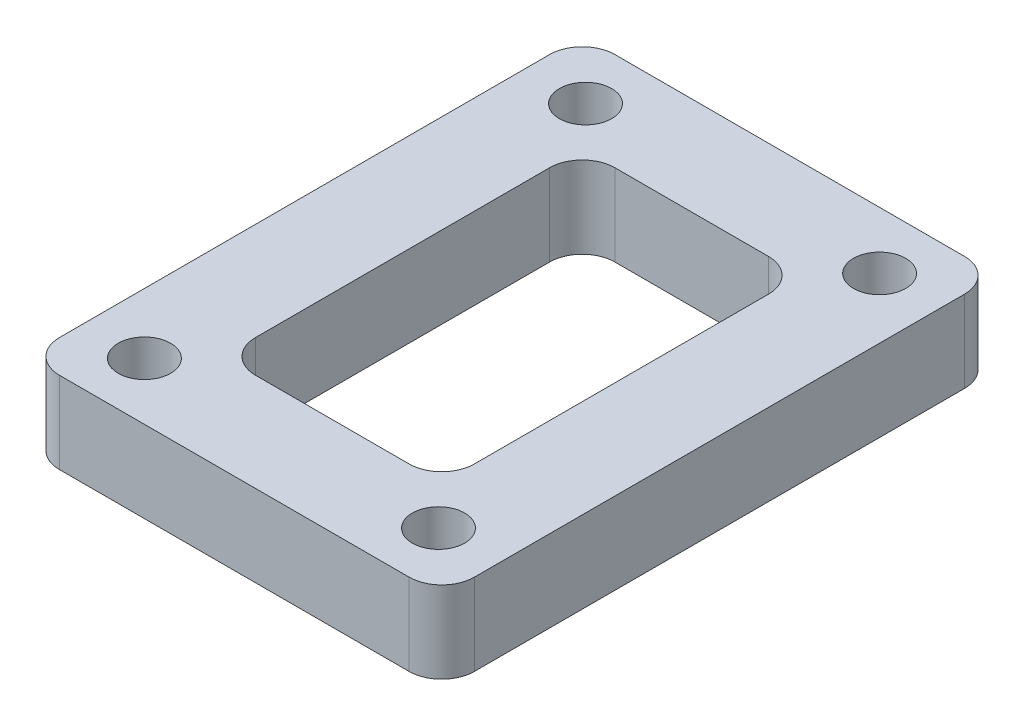
ISO-10303-21;
HEADER;
FILE_DESCRIPTION(('STEP AP214'),'2;1');
FILE_NAME('part.step','',(''),(''),'','','');
FILE_SCHEMA(('AUTOMOTIVE_DESIGN { 1 0 10303 214 1 1 1 1 }'));
ENDSEC;
DATA;
#1=APPLICATION_CONTEXT('core data for automotive mechanical design processes');
#2=APPLICATION_PROTOCOL_DEFINITION('international standard','automotive_design',2000,#1);
#3=PRODUCT_CONTEXT('',#1,'mechanical');
#4=PRODUCT('Part','Part','',(#3));
#5=PRODUCT_RELATED_PRODUCT_CATEGORY('part','',(#4));
#6=PRODUCT_DEFINITION_FORMATION('','',#4);
#7=PRODUCT_DEFINITION_CONTEXT('part definition',#1,'design');
#8=PRODUCT_DEFINITION('design','',#6,#7);
#9=PRODUCT_DEFINITION_SHAPE('','',#8);
#10=(LENGTH_UNIT() NAMED_UNIT(*) SI_UNIT(.MILLI.,.METRE.));
#11=(NAMED_UNIT(*) PLANE_ANGLE_UNIT() SI_UNIT($,.RADIAN.));
#12=(NAMED_UNIT(*) SI_UNIT($,.STERADIAN.) SOLID_ANGLE_UNIT());
#13=UNCERTAINTY_MEASURE_WITH_UNIT(LENGTH_MEASURE(1.E-05),#10,'distance_accuracy_value','');
#14=(GEOMETRIC_REPRESENTATION_CONTEXT(3) GLOBAL_UNCERTAINTY_ASSIGNED_CONTEXT((#13)) GLOBAL_UNIT_ASSIGNED_CONTEXT((#10,
#11,#12)) REPRESENTATION_CONTEXT('',''));
#15=CARTESIAN_POINT('',(0.,0.,0.));
#16=DIRECTION('',(0.,0.,1.));
#17=DIRECTION('',(1.,0.,0.));
#18=AXIS2_PLACEMENT_3D('',#15,#16,#17);
#19=CARTESIAN_POINT('',(0.,5.,0.));
#20=DIRECTION('',(0.,1.,0.));
#21=DIRECTION('',(0.,0.,1.));
#22=AXIS2_PLACEMENT_3D('',#19,#20,#21);
#23=PLANE('',#22);
#24=CARTESIAN_POINT('',(9.,5.,13.5));
#25=DIRECTION('',(0.,1.,0.));
#26=DIRECTION('',(0.,0.,1.));
#27=AXIS2_PLACEMENT_3D('',#24,#25,#26);
#28=CIRCLE('',#27,1.6);
#29=CARTESIAN_POINT('',(9.,5.,15.1));
#30=VERTEX_POINT('',#29);
#31=EDGE_CURVE('E532',#30,#30,#28,.T.);
#32=ORIENTED_EDGE('',*,*,#31,.F.);
#33=EDGE_LOOP('',(#32));
#34=FACE_BOUND('',#33,.T.);
#35=CARTESIAN_POINT('',(-9.,5.,-13.5));
#36=DIRECTION('',(0.,1.,0.));
#37=DIRECTION('',(0.,0.,1.));
#38=AXIS2_PLACEMENT_3D('',#35,#36,#37);
#39=CIRCLE('',#38,1.6);
#40=CARTESIAN_POINT('',(-9.,5.,-11.9));
#41=VERTEX_POINT('',#40);
#42=EDGE_CURVE('E279',#41,#41,#39,.T.);
#43=ORIENTED_EDGE('',*,*,#42,.F.);
#44=EDGE_LOOP('',(#43));
#45=FACE_BOUND('',#44,.T.);
#46=DIRECTION('',(-1.,0.,0.));
#47=VECTOR('',#46,1.);
#48=CARTESIAN_POINT('',(-12.7,5.,-17.));
#49=LINE('',#48,#47);
#50=CARTESIAN_POINT('',(10.7,5.,-17.));
#51=VERTEX_POINT('',#50);
#52=CARTESIAN_POINT('',(-10.7,5.,-17.));
#53=VERTEX_POINT('',#52);
#54=EDGE_CURVE('E284',#51,#53,#49,.T.);
#55=ORIENTED_EDGE('',*,*,#54,.T.);
#56=CARTESIAN_POINT('',(-10.7,5.,-15.));
#57=DIRECTION('',(0.,1.,0.));
#58=DIRECTION('',(0.,0.,1.));
#59=AXIS2_PLACEMENT_3D('',#56,#57,#58);
#60=CIRCLE('',#59,2.);
#61=CARTESIAN_POINT('',(-12.7,5.,-15.));
#62=VERTEX_POINT('',#61);
#63=EDGE_CURVE('E201',#53,#62,#60,.T.);
#64=ORIENTED_EDGE('',*,*,#63,.T.);
#65=DIRECTION('',(0.,0.,1.));
#66=VECTOR('',#65,1.);
#67=CARTESIAN_POINT('',(-12.7,5.,-17.));
#68=LINE('',#67,#66);
#69=CARTESIAN_POINT('',(-12.7,5.,15.));
#70=VERTEX_POINT('',#69);
#71=EDGE_CURVE('E169',#62,#70,#68,.T.);
#72=ORIENTED_EDGE('',*,*,#71,.T.);
#73=CARTESIAN_POINT('',(-10.7,5.,15.));
#74=DIRECTION('',(0.,1.,0.));
#75=DIRECTION('',(0.,0.,1.));
#76=AXIS2_PLACEMENT_3D('',#73,#74,#75);
#77=CIRCLE('',#76,2.);
#78=CARTESIAN_POINT('',(-10.7,5.,17.));
#79=VERTEX_POINT('',#78);
#80=EDGE_CURVE('E195',#70,#79,#77,.T.);
#81=ORIENTED_EDGE('',*,*,#80,.T.);
#82=DIRECTION('',(1.,0.,0.));
#83=VECTOR('',#82,1.);
#84=CARTESIAN_POINT('',(-12.7,5.,17.));
#85=LINE('',#84,#83);
#86=CARTESIAN_POINT('',(10.7,5.,17.));
#87=VERTEX_POINT('',#86);
#88=EDGE_CURVE('E186',#79,#87,#85,.T.);
#89=ORIENTED_EDGE('',*,*,#88,.T.);
#90=CARTESIAN_POINT('',(10.7,5.,15.));
#91=DIRECTION('',(0.,1.,0.));
#92=DIRECTION('',(0.,0.,1.));
#93=AXIS2_PLACEMENT_3D('',#90,#91,#92);
#94=CIRCLE('',#93,2.);
#95=CARTESIAN_POINT('',(12.7,5.,15.));
#96=VERTEX_POINT('',#95);
#97=EDGE_CURVE('E197',#87,#96,#94,.T.);
#98=ORIENTED_EDGE('',*,*,#97,.T.);
#99=DIRECTION('',(0.,0.,-1.));
#100=VECTOR('',#99,1.);
#101=CARTESIAN_POINT('',(12.7,5.,-17.));
#102=LINE('',#101,#100);
#103=CARTESIAN_POINT('',(12.7,5.,-15.));
#104=VERTEX_POINT('',#103);
#105=EDGE_CURVE('E180',#96,#104,#102,.T.);
#106=ORIENTED_EDGE('',*,*,#105,.T.);
#107=CARTESIAN_POINT('',(10.7,5.,-15.));
#108=DIRECTION('',(0.,1.,0.));
#109=DIRECTION('',(0.,0.,1.));
#110=AXIS2_PLACEMENT_3D('',#107,#108,#109);
#111=CIRCLE('',#110,2.);
#112=EDGE_CURVE('E199',#104,#51,#111,.T.);
#113=ORIENTED_EDGE('',*,*,#112,.T.);
#114=EDGE_LOOP('',(#55,#64,#72,#81,#89,#98,#106,#113));
#115=FACE_BOUND('',#114,.T.);
#116=DIRECTION('',(0.,0.,1.));
#117=VECTOR('',#116,1.);
#118=CARTESIAN_POINT('',(-6.7,5.,-11.));
#119=LINE('',#118,#117);
#120=CARTESIAN_POINT('',(-6.7,5.,-9.00000000000001));
#121=VERTEX_POINT('',#120);
#122=CARTESIAN_POINT('',(-6.7,5.,9.));
#123=VERTEX_POINT('',#122);
#124=EDGE_CURVE('E260',#121,#123,#119,.T.);
#125=ORIENTED_EDGE('',*,*,#124,.F.);
#126=CARTESIAN_POINT('',(-4.7,5.,-9.00000000000001));
#127=DIRECTION('',(0.,1.,0.));
#128=DIRECTION('',(0.,0.,1.));
#129=AXIS2_PLACEMENT_3D('',#126,#127,#128);
#130=CIRCLE('',#129,2.);
#131=CARTESIAN_POINT('',(-4.7,5.,-11.));
#132=VERTEX_POINT('',#131);
#133=EDGE_CURVE('E241',#121,#132,#130,.F.);
#134=ORIENTED_EDGE('',*,*,#133,.T.);
#135=DIRECTION('',(-1.,0.,0.));
#136=VECTOR('',#135,1.);
#137=CARTESIAN_POINT('',(-6.7,5.,-11.));
#138=LINE('',#137,#136);
#139=CARTESIAN_POINT('',(4.7,5.,-11.));
#140=VERTEX_POINT('',#139);
#141=EDGE_CURVE('E266',#140,#132,#138,.T.);
#142=ORIENTED_EDGE('',*,*,#141,.F.);
#143=CARTESIAN_POINT('',(4.7,5.,-9.00000000000001));
#144=DIRECTION('',(0.,1.,0.));
#145=DIRECTION('',(0.,0.,1.));
#146=AXIS2_PLACEMENT_3D('',#143,#144,#145);
#147=CIRCLE('',#146,2.);
#148=CARTESIAN_POINT('',(6.7,5.,-9.00000000000001));
#149=VERTEX_POINT('',#148);
#150=EDGE_CURVE('E237',#140,#149,#147,.F.);
#151=ORIENTED_EDGE('',*,*,#150,.T.);
#152=DIRECTION('',(0.,0.,-1.));
#153=VECTOR('',#152,1.);
#154=CARTESIAN_POINT('',(6.7,5.,-11.));
#155=LINE('',#154,#153);
#156=CARTESIAN_POINT('',(6.7,5.,9.));
#157=VERTEX_POINT('',#156);
#158=EDGE_CURVE('E268',#157,#149,#155,.T.);
#159=ORIENTED_EDGE('',*,*,#158,.F.);
#160=CARTESIAN_POINT('',(4.7,5.,9.));
#161=DIRECTION('',(0.,1.,0.));
#162=DIRECTION('',(0.,0.,1.));
#163=AXIS2_PLACEMENT_3D('',#160,#161,#162);
#164=CIRCLE('',#163,2.);
#165=CARTESIAN_POINT('',(4.7,5.,11.));
#166=VERTEX_POINT('',#165);
#167=EDGE_CURVE('E50',#157,#166,#164,.F.);
#168=ORIENTED_EDGE('',*,*,#167,.T.);
#169=DIRECTION('',(1.,0.,0.));
#170=VECTOR('',#169,1.);
#171=CARTESIAN_POINT('',(-6.7,5.,11.));
#172=LINE('',#171,#170);
#173=CARTESIAN_POINT('',(-4.7,5.,11.));
#174=VERTEX_POINT('',#173);
#175=EDGE_CURVE('E262',#174,#166,#172,.T.);
#176=ORIENTED_EDGE('',*,*,#175,.F.);
#177=CARTESIAN_POINT('',(-4.7,5.,9.));
#178=DIRECTION('',(0.,1.,0.));
#179=DIRECTION('',(0.,0.,1.));
#180=AXIS2_PLACEMENT_3D('',#177,#178,#179);
#181=CIRCLE('',#180,2.);
#182=EDGE_CURVE('E11',#174,#123,#181,.F.);
#183=ORIENTED_EDGE('',*,*,#182,.T.);
#184=EDGE_LOOP('',(#125,#134,#142,#151,#159,#168,#176,#183));
#185=FACE_BOUND('',#184,.T.);
#186=CARTESIAN_POINT('',(9.,5.,-13.5));
#187=DIRECTION('',(0.,1.,0.));
#188=DIRECTION('',(0.,0.,-1.));
#189=AXIS2_PLACEMENT_3D('',#186,#187,#188);
#190=CIRCLE('',#189,1.6);
#191=CARTESIAN_POINT('',(9.,5.,-15.1));
#192=VERTEX_POINT('',#191);
#193=EDGE_CURVE('E525',#192,#192,#190,.T.);
#194=ORIENTED_EDGE('',*,*,#193,.F.);
#195=EDGE_LOOP('',(#194));
#196=FACE_BOUND('',#195,.T.);
#197=CARTESIAN_POINT('',(-9.,5.,13.5));
#198=DIRECTION('',(0.,1.,0.));
#199=DIRECTION('',(0.,0.,-1.));
#200=AXIS2_PLACEMENT_3D('',#197,#198,#199);
#201=CIRCLE('',#200,1.6);
#202=CARTESIAN_POINT('',(-9.,5.,11.9));
#203=VERTEX_POINT('',#202);
#204=EDGE_CURVE('E537',#203,#203,#201,.T.);
#205=ORIENTED_EDGE('',*,*,#204,.F.);
#206=EDGE_LOOP('',(#205));
#207=FACE_BOUND('',#206,.T.);
#208=ADVANCED_FACE('F35',(#34,#45,#115,#185,#196,#207),#23,.T.);
#209=CARTESIAN_POINT('',(0.,0.,0.));
#210=DIRECTION('',(0.,1.,0.));
#211=DIRECTION('',(0.,0.,1.));
#212=AXIS2_PLACEMENT_3D('',#209,#210,#211);
#213=PLANE('',#212);
#214=DIRECTION('',(0.,0.,1.));
#215=VECTOR('',#214,1.);
#216=CARTESIAN_POINT('',(-12.7,0.,-17.));
#217=LINE('',#216,#215);
#218=CARTESIAN_POINT('',(-12.7,0.,-15.));
#219=VERTEX_POINT('',#218);
#220=CARTESIAN_POINT('',(-12.7,0.,15.));
#221=VERTEX_POINT('',#220);
#222=EDGE_CURVE('E166',#219,#221,#217,.T.);
#223=ORIENTED_EDGE('',*,*,#222,.F.);
#224=CARTESIAN_POINT('',(-10.7,0.,-15.));
#225=DIRECTION('',(0.,1.,0.));
#226=DIRECTION('',(0.,0.,1.));
#227=AXIS2_PLACEMENT_3D('',#224,#225,#226);
#228=CIRCLE('',#227,2.);
#229=CARTESIAN_POINT('',(-10.7,0.,-17.));
#230=VERTEX_POINT('',#229);
#231=EDGE_CURVE('E149',#219,#230,#228,.F.);
#232=ORIENTED_EDGE('',*,*,#231,.T.);
#233=DIRECTION('',(-1.,0.,0.));
#234=VECTOR('',#233,1.);
#235=CARTESIAN_POINT('',(-12.7,0.,-17.));
#236=LINE('',#235,#234);
#237=CARTESIAN_POINT('',(10.7,0.,-17.));
#238=VERTEX_POINT('',#237);
#239=EDGE_CURVE('E177',#238,#230,#236,.T.);
#240=ORIENTED_EDGE('',*,*,#239,.F.);
#241=CARTESIAN_POINT('',(10.7,0.,-15.));
#242=DIRECTION('',(0.,1.,0.));
#243=DIRECTION('',(0.,0.,1.));
#244=AXIS2_PLACEMENT_3D('',#241,#242,#243);
#245=CIRCLE('',#244,2.);
#246=CARTESIAN_POINT('',(12.7,0.,-15.));
#247=VERTEX_POINT('',#246);
#248=EDGE_CURVE('E160',#238,#247,#245,.F.);
#249=ORIENTED_EDGE('',*,*,#248,.T.);
#250=DIRECTION('',(0.,0.,-1.));
#251=VECTOR('',#250,1.);
#252=CARTESIAN_POINT('',(12.7,0.,-17.));
#253=LINE('',#252,#251);
#254=CARTESIAN_POINT('',(12.7,0.,15.));
#255=VERTEX_POINT('',#254);
#256=EDGE_CURVE('E182',#255,#247,#253,.T.);
#257=ORIENTED_EDGE('',*,*,#256,.F.);
#258=CARTESIAN_POINT('',(10.7,0.,15.));
#259=DIRECTION('',(0.,1.,0.));
#260=DIRECTION('',(0.,0.,1.));
#261=AXIS2_PLACEMENT_3D('',#258,#259,#260);
#262=CIRCLE('',#261,2.);
#263=CARTESIAN_POINT('',(10.7,0.,17.));
#264=VERTEX_POINT('',#263);
#265=EDGE_CURVE('E189',#255,#264,#262,.F.);
#266=ORIENTED_EDGE('',*,*,#265,.T.);
#267=DIRECTION('',(1.,0.,0.));
#268=VECTOR('',#267,1.);
#269=CARTESIAN_POINT('',(-12.7,0.,17.));
#270=LINE('',#269,#268);
#271=CARTESIAN_POINT('',(-10.7,0.,17.));
#272=VERTEX_POINT('',#271);
#273=EDGE_CURVE('E176',#272,#264,#270,.T.);
#274=ORIENTED_EDGE('',*,*,#273,.F.);
#275=CARTESIAN_POINT('',(-10.7,0.,15.));
#276=DIRECTION('',(0.,1.,0.));
#277=DIRECTION('',(0.,0.,1.));
#278=AXIS2_PLACEMENT_3D('',#275,#276,#277);
#279=CIRCLE('',#278,2.);
#280=EDGE_CURVE('E170',#272,#221,#279,.F.);
#281=ORIENTED_EDGE('',*,*,#280,.T.);
#282=EDGE_LOOP('',(#223,#232,#240,#249,#257,#266,#274,#281));
#283=FACE_BOUND('',#282,.T.);
#284=DIRECTION('',(0.,0.,-1.));
#285=VECTOR('',#284,1.);
#286=CARTESIAN_POINT('',(6.7,0.,-11.));
#287=LINE('',#286,#285);
#288=CARTESIAN_POINT('',(6.7,0.,9.));
#289=VERTEX_POINT('',#288);
#290=CARTESIAN_POINT('',(6.7,0.,-9.00000000000001));
#291=VERTEX_POINT('',#290);
#292=EDGE_CURVE('E253',#289,#291,#287,.T.);
#293=ORIENTED_EDGE('',*,*,#292,.T.);
#294=CARTESIAN_POINT('',(4.7,0.,-9.00000000000001));
#295=DIRECTION('',(0.,1.,0.));
#296=DIRECTION('',(0.,0.,1.));
#297=AXIS2_PLACEMENT_3D('',#294,#295,#296);
#298=CIRCLE('',#297,2.);
#299=CARTESIAN_POINT('',(4.7,0.,-11.));
#300=VERTEX_POINT('',#299);
#301=EDGE_CURVE('E235',#291,#300,#298,.T.);
#302=ORIENTED_EDGE('',*,*,#301,.T.);
#303=DIRECTION('',(-1.,0.,0.));
#304=VECTOR('',#303,1.);
#305=CARTESIAN_POINT('',(-6.7,0.,-11.));
#306=LINE('',#305,#304);
#307=CARTESIAN_POINT('',(-4.7,0.,-11.));
#308=VERTEX_POINT('',#307);
#309=EDGE_CURVE('E276',#300,#308,#306,.T.);
#310=ORIENTED_EDGE('',*,*,#309,.T.);
#311=CARTESIAN_POINT('',(-4.7,0.,-9.00000000000001));
#312=DIRECTION('',(0.,1.,0.));
#313=DIRECTION('',(0.,0.,1.));
#314=AXIS2_PLACEMENT_3D('',#311,#312,#313);
#315=CIRCLE('',#314,2.);
#316=CARTESIAN_POINT('',(-6.7,0.,-9.00000000000001));
#317=VERTEX_POINT('',#316);
#318=EDGE_CURVE('E239',#308,#317,#315,.T.);
#319=ORIENTED_EDGE('',*,*,#318,.T.);
#320=DIRECTION('',(0.,0.,1.));
#321=VECTOR('',#320,1.);
#322=CARTESIAN_POINT('',(-6.7,0.,-11.));
#323=LINE('',#322,#321);
#324=CARTESIAN_POINT('',(-6.7,0.,9.));
#325=VERTEX_POINT('',#324);
#326=EDGE_CURVE('E248',#317,#325,#323,.T.);
#327=ORIENTED_EDGE('',*,*,#326,.T.);
#328=CARTESIAN_POINT('',(-4.7,0.,9.));
#329=DIRECTION('',(0.,1.,0.));
#330=DIRECTION('',(0.,0.,1.));
#331=AXIS2_PLACEMENT_3D('',#328,#329,#330);
#332=CIRCLE('',#331,2.);
#333=CARTESIAN_POINT('',(-4.7,0.,11.));
#334=VERTEX_POINT('',#333);
#335=EDGE_CURVE('E43',#325,#334,#332,.T.);
#336=ORIENTED_EDGE('',*,*,#335,.T.);
#337=DIRECTION('',(1.,0.,0.));
#338=VECTOR('',#337,1.);
#339=CARTESIAN_POINT('',(-6.7,0.,11.));
#340=LINE('',#339,#338);
#341=CARTESIAN_POINT('',(4.7,0.,11.));
#342=VERTEX_POINT('',#341);
#343=EDGE_CURVE('E246',#334,#342,#340,.T.);
#344=ORIENTED_EDGE('',*,*,#343,.T.);
#345=CARTESIAN_POINT('',(4.7,0.,9.));
#346=DIRECTION('',(0.,1.,0.));
#347=DIRECTION('',(0.,0.,1.));
#348=AXIS2_PLACEMENT_3D('',#345,#346,#347);
#349=CIRCLE('',#348,2.);
#350=EDGE_CURVE('E232',#342,#289,#349,.T.);
#351=ORIENTED_EDGE('',*,*,#350,.T.);
#352=EDGE_LOOP('',(#293,#302,#310,#319,#327,#336,#344,#351));
#353=FACE_BOUND('',#352,.T.);
#354=CARTESIAN_POINT('',(-9.,0.,-13.5));
#355=DIRECTION('',(0.,1.,0.));
#356=DIRECTION('',(0.,0.,1.));
#357=AXIS2_PLACEMENT_3D('',#354,#355,#356);
#358=CIRCLE('',#357,1.6);
#359=CARTESIAN_POINT('',(-9.,0.,-11.9));
#360=VERTEX_POINT('',#359);
#361=EDGE_CURVE('E524',#360,#360,#358,.T.);
#362=ORIENTED_EDGE('',*,*,#361,.T.);
#363=EDGE_LOOP('',(#362));
#364=FACE_BOUND('',#363,.T.);
#365=CARTESIAN_POINT('',(9.,0.,-13.5));
#366=DIRECTION('',(0.,1.,0.));
#367=DIRECTION('',(0.,0.,-1.));
#368=AXIS2_PLACEMENT_3D('',#365,#366,#367);
#369=CIRCLE('',#368,1.6);
#370=CARTESIAN_POINT('',(9.,0.,-15.1));
#371=VERTEX_POINT('',#370);
#372=EDGE_CURVE('E528',#371,#371,#369,.T.);
#373=ORIENTED_EDGE('',*,*,#372,.T.);
#374=EDGE_LOOP('',(#373));
#375=FACE_BOUND('',#374,.T.);
#376=CARTESIAN_POINT('',(9.,0.,13.5));
#377=DIRECTION('',(0.,1.,0.));
#378=DIRECTION('',(0.,0.,1.));
#379=AXIS2_PLACEMENT_3D('',#376,#377,#378);
#380=CIRCLE('',#379,1.6);
#381=CARTESIAN_POINT('',(9.,0.,15.1));
#382=VERTEX_POINT('',#381);
#383=EDGE_CURVE('E534',#382,#382,#380,.T.);
#384=ORIENTED_EDGE('',*,*,#383,.T.);
#385=EDGE_LOOP('',(#384));
#386=FACE_BOUND('',#385,.T.);
#387=CARTESIAN_POINT('',(-9.,0.,13.5));
#388=DIRECTION('',(0.,1.,0.));
#389=DIRECTION('',(0.,0.,-1.));
#390=AXIS2_PLACEMENT_3D('',#387,#388,#389);
#391=CIRCLE('',#390,1.6);
#392=CARTESIAN_POINT('',(-9.,0.,11.9));
#393=VERTEX_POINT('',#392);
#394=EDGE_CURVE('E540',#393,#393,#391,.T.);
#395=ORIENTED_EDGE('',*,*,#394,.T.);
#396=EDGE_LOOP('',(#395));
#397=FACE_BOUND('',#396,.T.);
#398=ADVANCED_FACE('F173',(#283,#353,#364,#375,#386,#397),#213,.F.);
#399=CARTESIAN_POINT('',(12.7,5.,-17.));
#400=DIRECTION('',(-1.,0.,0.));
#401=DIRECTION('',(0.,0.,1.));
#402=AXIS2_PLACEMENT_3D('',#399,#400,#401);
#403=PLANE('',#402);
#404=ORIENTED_EDGE('',*,*,#256,.T.);
#405=DIRECTION('',(0.,-1.,0.));
#406=VECTOR('',#405,1.);
#407=CARTESIAN_POINT('',(12.7,5.,-15.));
#408=LINE('',#407,#406);
#409=EDGE_CURVE('E206',#247,#104,#408,.F.);
#410=ORIENTED_EDGE('',*,*,#409,.T.);
#411=ORIENTED_EDGE('',*,*,#105,.F.);
#412=DIRECTION('',(0.,-1.,0.));
#413=VECTOR('',#412,1.);
#414=CARTESIAN_POINT('',(12.7,5.,15.));
#415=LINE('',#414,#413);
#416=EDGE_CURVE('E203',#96,#255,#415,.T.);
#417=ORIENTED_EDGE('',*,*,#416,.T.);
#418=EDGE_LOOP('',(#404,#410,#411,#417));
#419=FACE_BOUND('',#418,.T.);
#420=ADVANCED_FACE('F293',(#419),#403,.F.);
#421=CARTESIAN_POINT('',(-12.7,5.,-17.));
#422=DIRECTION('',(0.,0.,1.));
#423=DIRECTION('',(1.,0.,0.));
#424=AXIS2_PLACEMENT_3D('',#421,#422,#423);
#425=PLANE('',#424);
#426=ORIENTED_EDGE('',*,*,#239,.T.);
#427=DIRECTION('',(0.,-1.,0.));
#428=VECTOR('',#427,1.);
#429=CARTESIAN_POINT('',(-10.7,5.,-17.));
#430=LINE('',#429,#428);
#431=EDGE_CURVE('E154',#230,#53,#430,.F.);
#432=ORIENTED_EDGE('',*,*,#431,.T.);
#433=ORIENTED_EDGE('',*,*,#54,.F.);
#434=DIRECTION('',(0.,-1.,0.));
#435=VECTOR('',#434,1.);
#436=CARTESIAN_POINT('',(10.7,5.,-17.));
#437=LINE('',#436,#435);
#438=EDGE_CURVE('E159',#51,#238,#437,.T.);
#439=ORIENTED_EDGE('',*,*,#438,.T.);
#440=EDGE_LOOP('',(#426,#432,#433,#439));
#441=FACE_BOUND('',#440,.T.);
#442=ADVANCED_FACE('F303',(#441),#425,.F.);
#443=CARTESIAN_POINT('',(-12.7,5.,-17.));
#444=DIRECTION('',(1.,0.,0.));
#445=DIRECTION('',(0.,0.,-1.));
#446=AXIS2_PLACEMENT_3D('',#443,#444,#445);
#447=PLANE('',#446);
#448=ORIENTED_EDGE('',*,*,#71,.F.);
#449=DIRECTION('',(0.,-1.,0.));
#450=VECTOR('',#449,1.);
#451=CARTESIAN_POINT('',(-12.7,5.,-15.));
#452=LINE('',#451,#450);
#453=EDGE_CURVE('E153',#62,#219,#452,.T.);
#454=ORIENTED_EDGE('',*,*,#453,.T.);
#455=ORIENTED_EDGE('',*,*,#222,.T.);
#456=DIRECTION('',(0.,-1.,0.));
#457=VECTOR('',#456,1.);
#458=CARTESIAN_POINT('',(-12.7,5.,15.));
#459=LINE('',#458,#457);
#460=EDGE_CURVE('E171',#221,#70,#459,.F.);
#461=ORIENTED_EDGE('',*,*,#460,.T.);
#462=EDGE_LOOP('',(#448,#454,#455,#461));
#463=FACE_BOUND('',#462,.T.);
#464=ADVANCED_FACE('F165',(#463),#447,.F.);
#465=CARTESIAN_POINT('',(-12.7,5.,17.));
#466=DIRECTION('',(0.,0.,-1.));
#467=DIRECTION('',(-1.,0.,0.));
#468=AXIS2_PLACEMENT_3D('',#465,#466,#467);
#469=PLANE('',#468);
#470=ORIENTED_EDGE('',*,*,#273,.T.);
#471=DIRECTION('',(0.,-1.,0.));
#472=VECTOR('',#471,1.);
#473=CARTESIAN_POINT('',(10.7,5.,17.));
#474=LINE('',#473,#472);
#475=EDGE_CURVE('E211',#264,#87,#474,.F.);
#476=ORIENTED_EDGE('',*,*,#475,.T.);
#477=ORIENTED_EDGE('',*,*,#88,.F.);
#478=DIRECTION('',(0.,-1.,0.));
#479=VECTOR('',#478,1.);
#480=CARTESIAN_POINT('',(-10.7,5.,17.));
#481=LINE('',#480,#479);
#482=EDGE_CURVE('E208',#79,#272,#481,.T.);
#483=ORIENTED_EDGE('',*,*,#482,.T.);
#484=EDGE_LOOP('',(#470,#476,#477,#483));
#485=FACE_BOUND('',#484,.T.);
#486=ADVANCED_FACE('F310',(#485),#469,.F.);
#487=CARTESIAN_POINT('',(-6.7,5.,-11.));
#488=DIRECTION('',(0.,0.,1.));
#489=DIRECTION('',(1.,0.,0.));
#490=AXIS2_PLACEMENT_3D('',#487,#488,#489);
#491=PLANE('',#490);
#492=ORIENTED_EDGE('',*,*,#309,.F.);
#493=DIRECTION('',(0.,-1.,0.));
#494=VECTOR('',#493,1.);
#495=CARTESIAN_POINT('',(4.7,5.,-11.));
#496=LINE('',#495,#494);
#497=EDGE_CURVE('E225',#300,#140,#496,.F.);
#498=ORIENTED_EDGE('',*,*,#497,.T.);
#499=ORIENTED_EDGE('',*,*,#141,.T.);
#500=DIRECTION('',(0.,-1.,0.));
#501=VECTOR('',#500,1.);
#502=CARTESIAN_POINT('',(-4.7,0.,-11.));
#503=LINE('',#502,#501);
#504=EDGE_CURVE('E222',#132,#308,#503,.T.);
#505=ORIENTED_EDGE('',*,*,#504,.T.);
#506=EDGE_LOOP('',(#492,#498,#499,#505));
#507=FACE_BOUND('',#506,.T.);
#508=ADVANCED_FACE('F323',(#507),#491,.T.);
#509=CARTESIAN_POINT('',(-6.7,5.,-11.));
#510=DIRECTION('',(1.,0.,0.));
#511=DIRECTION('',(0.,0.,-1.));
#512=AXIS2_PLACEMENT_3D('',#509,#510,#511);
#513=PLANE('',#512);
#514=ORIENTED_EDGE('',*,*,#326,.F.);
#515=DIRECTION('',(0.,-1.,0.));
#516=VECTOR('',#515,1.);
#517=CARTESIAN_POINT('',(-6.7,5.,-9.00000000000001));
#518=LINE('',#517,#516);
#519=EDGE_CURVE('E230',#317,#121,#518,.F.);
#520=ORIENTED_EDGE('',*,*,#519,.T.);
#521=ORIENTED_EDGE('',*,*,#124,.T.);
#522=DIRECTION('',(0.,-1.,0.));
#523=VECTOR('',#522,1.);
#524=CARTESIAN_POINT('',(-6.7,0.,9.));
#525=LINE('',#524,#523);
#526=EDGE_CURVE('E227',#123,#325,#525,.T.);
#527=ORIENTED_EDGE('',*,*,#526,.T.);
#528=EDGE_LOOP('',(#514,#520,#521,#527));
#529=FACE_BOUND('',#528,.T.);
#530=ADVANCED_FACE('F264',(#529),#513,.T.);
#531=CARTESIAN_POINT('',(-6.7,5.,11.));
#532=DIRECTION('',(0.,0.,-1.));
#533=DIRECTION('',(-1.,0.,0.));
#534=AXIS2_PLACEMENT_3D('',#531,#532,#533);
#535=PLANE('',#534);
#536=ORIENTED_EDGE('',*,*,#175,.T.);
#537=DIRECTION('',(0.,-1.,0.));
#538=VECTOR('',#537,1.);
#539=CARTESIAN_POINT('',(4.7,0.,11.));
#540=LINE('',#539,#538);
#541=EDGE_CURVE('E214',#166,#342,#540,.T.);
#542=ORIENTED_EDGE('',*,*,#541,.T.);
#543=ORIENTED_EDGE('',*,*,#343,.F.);
#544=DIRECTION('',(0.,-1.,0.));
#545=VECTOR('',#544,1.);
#546=CARTESIAN_POINT('',(-4.7,5.,11.));
#547=LINE('',#546,#545);
#548=EDGE_CURVE('E57',#334,#174,#547,.F.);
#549=ORIENTED_EDGE('',*,*,#548,.T.);
#550=EDGE_LOOP('',(#536,#542,#543,#549));
#551=FACE_BOUND('',#550,.T.);
#552=ADVANCED_FACE('F251',(#551),#535,.T.);
#553=CARTESIAN_POINT('',(6.7,5.,-11.));
#554=DIRECTION('',(-1.,0.,0.));
#555=DIRECTION('',(0.,0.,1.));
#556=AXIS2_PLACEMENT_3D('',#553,#554,#555);
#557=PLANE('',#556);
#558=ORIENTED_EDGE('',*,*,#292,.F.);
#559=DIRECTION('',(0.,-1.,0.));
#560=VECTOR('',#559,1.);
#561=CARTESIAN_POINT('',(6.7,5.,9.));
#562=LINE('',#561,#560);
#563=EDGE_CURVE('E220',#289,#157,#562,.F.);
#564=ORIENTED_EDGE('',*,*,#563,.T.);
#565=ORIENTED_EDGE('',*,*,#158,.T.);
#566=DIRECTION('',(0.,-1.,0.));
#567=VECTOR('',#566,1.);
#568=CARTESIAN_POINT('',(6.7,0.,-9.00000000000001));
#569=LINE('',#568,#567);
#570=EDGE_CURVE('E217',#149,#291,#569,.T.);
#571=ORIENTED_EDGE('',*,*,#570,.T.);
#572=EDGE_LOOP('',(#558,#564,#565,#571));
#573=FACE_BOUND('',#572,.T.);
#574=ADVANCED_FACE('F386',(#573),#557,.T.);
#575=CARTESIAN_POINT('',(-9.,5.,-13.5));
#576=DIRECTION('',(0.,-1.,0.));
#577=DIRECTION('',(0.,0.,-1.));
#578=AXIS2_PLACEMENT_3D('',#575,#576,#577);
#579=CYLINDRICAL_SURFACE('',#578,1.6);
#580=ORIENTED_EDGE('',*,*,#42,.T.);
#581=EDGE_LOOP('',(#580));
#582=FACE_BOUND('',#581,.T.);
#583=ORIENTED_EDGE('',*,*,#361,.F.);
#584=EDGE_LOOP('',(#583));
#585=FACE_BOUND('',#584,.T.);
#586=ADVANCED_FACE('F382',(#582,#585),#579,.F.);
#587=CARTESIAN_POINT('',(9.,5.,-13.5));
#588=DIRECTION('',(0.,-1.,0.));
#589=DIRECTION('',(0.,0.,-1.));
#590=AXIS2_PLACEMENT_3D('',#587,#588,#589);
#591=CYLINDRICAL_SURFACE('',#590,1.6);
#592=ORIENTED_EDGE('',*,*,#193,.T.);
#593=EDGE_LOOP('',(#592));
#594=FACE_BOUND('',#593,.T.);
#595=ORIENTED_EDGE('',*,*,#372,.F.);
#596=EDGE_LOOP('',(#595));
#597=FACE_BOUND('',#596,.T.);
#598=ADVANCED_FACE('F374',(#594,#597),#591,.F.);
#599=CARTESIAN_POINT('',(9.,5.,13.5));
#600=DIRECTION('',(0.,-1.,0.));
#601=DIRECTION('',(0.,0.,-1.));
#602=AXIS2_PLACEMENT_3D('',#599,#600,#601);
#603=CYLINDRICAL_SURFACE('',#602,1.6);
#604=ORIENTED_EDGE('',*,*,#31,.T.);
#605=EDGE_LOOP('',(#604));
#606=FACE_BOUND('',#605,.T.);
#607=ORIENTED_EDGE('',*,*,#383,.F.);
#608=EDGE_LOOP('',(#607));
#609=FACE_BOUND('',#608,.T.);
#610=ADVANCED_FACE('F368',(#606,#609),#603,.F.);
#611=CARTESIAN_POINT('',(-9.,5.,13.5));
#612=DIRECTION('',(0.,-1.,0.));
#613=DIRECTION('',(0.,0.,-1.));
#614=AXIS2_PLACEMENT_3D('',#611,#612,#613);
#615=CYLINDRICAL_SURFACE('',#614,1.6);
#616=ORIENTED_EDGE('',*,*,#204,.T.);
#617=EDGE_LOOP('',(#616));
#618=FACE_BOUND('',#617,.T.);
#619=ORIENTED_EDGE('',*,*,#394,.F.);
#620=EDGE_LOOP('',(#619));
#621=FACE_BOUND('',#620,.T.);
#622=ADVANCED_FACE('F364',(#618,#621),#615,.F.);
#623=CARTESIAN_POINT('',(-10.7,5.,-15.));
#624=DIRECTION('',(0.,-1.,0.));
#625=DIRECTION('',(0.,0.,-1.));
#626=AXIS2_PLACEMENT_3D('',#623,#624,#625);
#627=CYLINDRICAL_SURFACE('',#626,2.);
#628=ORIENTED_EDGE('',*,*,#63,.F.);
#629=ORIENTED_EDGE('',*,*,#431,.F.);
#630=ORIENTED_EDGE('',*,*,#231,.F.);
#631=ORIENTED_EDGE('',*,*,#453,.F.);
#632=EDGE_LOOP('',(#628,#629,#630,#631));
#633=FACE_BOUND('',#632,.T.);
#634=ADVANCED_FACE('F152',(#633),#627,.T.);
#635=CARTESIAN_POINT('',(10.7,5.,-15.));
#636=DIRECTION('',(0.,-1.,0.));
#637=DIRECTION('',(0.,0.,-1.));
#638=AXIS2_PLACEMENT_3D('',#635,#636,#637);
#639=CYLINDRICAL_SURFACE('',#638,2.);
#640=ORIENTED_EDGE('',*,*,#112,.F.);
#641=ORIENTED_EDGE('',*,*,#409,.F.);
#642=ORIENTED_EDGE('',*,*,#248,.F.);
#643=ORIENTED_EDGE('',*,*,#438,.F.);
#644=EDGE_LOOP('',(#640,#641,#642,#643));
#645=FACE_BOUND('',#644,.T.);
#646=ADVANCED_FACE('F298',(#645),#639,.T.);
#647=CARTESIAN_POINT('',(10.7,5.,15.));
#648=DIRECTION('',(0.,-1.,0.));
#649=DIRECTION('',(0.,0.,-1.));
#650=AXIS2_PLACEMENT_3D('',#647,#648,#649);
#651=CYLINDRICAL_SURFACE('',#650,2.);
#652=ORIENTED_EDGE('',*,*,#97,.F.);
#653=ORIENTED_EDGE('',*,*,#475,.F.);
#654=ORIENTED_EDGE('',*,*,#265,.F.);
#655=ORIENTED_EDGE('',*,*,#416,.F.);
#656=EDGE_LOOP('',(#652,#653,#654,#655));
#657=FACE_BOUND('',#656,.T.);
#658=ADVANCED_FACE('F337',(#657),#651,.T.);
#659=CARTESIAN_POINT('',(4.7,5.,9.));
#660=DIRECTION('',(0.,1.,0.));
#661=DIRECTION('',(0.,0.,1.));
#662=AXIS2_PLACEMENT_3D('',#659,#660,#661);
#663=CYLINDRICAL_SURFACE('',#662,2.);
#664=ORIENTED_EDGE('',*,*,#167,.F.);
#665=ORIENTED_EDGE('',*,*,#563,.F.);
#666=ORIENTED_EDGE('',*,*,#350,.F.);
#667=ORIENTED_EDGE('',*,*,#541,.F.);
#668=EDGE_LOOP('',(#664,#665,#666,#667));
#669=FACE_BOUND('',#668,.T.);
#670=ADVANCED_FACE('F354',(#669),#663,.F.);
#671=CARTESIAN_POINT('',(4.7,5.,-9.00000000000001));
#672=DIRECTION('',(0.,1.,0.));
#673=DIRECTION('',(0.,0.,1.));
#674=AXIS2_PLACEMENT_3D('',#671,#672,#673);
#675=CYLINDRICAL_SURFACE('',#674,2.);
#676=ORIENTED_EDGE('',*,*,#150,.F.);
#677=ORIENTED_EDGE('',*,*,#497,.F.);
#678=ORIENTED_EDGE('',*,*,#301,.F.);
#679=ORIENTED_EDGE('',*,*,#570,.F.);
#680=EDGE_LOOP('',(#676,#677,#678,#679));
#681=FACE_BOUND('',#680,.T.);
#682=ADVANCED_FACE('F348',(#681),#675,.F.);
#683=CARTESIAN_POINT('',(-4.7,5.,-9.00000000000001));
#684=DIRECTION('',(0.,1.,0.));
#685=DIRECTION('',(0.,0.,1.));
#686=AXIS2_PLACEMENT_3D('',#683,#684,#685);
#687=CYLINDRICAL_SURFACE('',#686,2.);
#688=ORIENTED_EDGE('',*,*,#133,.F.);
#689=ORIENTED_EDGE('',*,*,#519,.F.);
#690=ORIENTED_EDGE('',*,*,#318,.F.);
#691=ORIENTED_EDGE('',*,*,#504,.F.);
#692=EDGE_LOOP('',(#688,#689,#690,#691));
#693=FACE_BOUND('',#692,.T.);
#694=ADVANCED_FACE('F344',(#693),#687,.F.);
#695=CARTESIAN_POINT('',(-4.7,5.,9.));
#696=DIRECTION('',(0.,1.,0.));
#697=DIRECTION('',(0.,0.,1.));
#698=AXIS2_PLACEMENT_3D('',#695,#696,#697);
#699=CYLINDRICAL_SURFACE('',#698,2.);
#700=ORIENTED_EDGE('',*,*,#182,.F.);
#701=ORIENTED_EDGE('',*,*,#548,.F.);
#702=ORIENTED_EDGE('',*,*,#335,.F.);
#703=ORIENTED_EDGE('',*,*,#526,.F.);
#704=EDGE_LOOP('',(#700,#701,#702,#703));
#705=FACE_BOUND('',#704,.T.);
#706=ADVANCED_FACE('F256',(#705),#699,.F.);
#707=CARTESIAN_POINT('',(-10.7,5.,15.));
#708=DIRECTION('',(0.,-1.,0.));
#709=DIRECTION('',(0.,0.,-1.));
#710=AXIS2_PLACEMENT_3D('',#707,#708,#709);
#711=CYLINDRICAL_SURFACE('',#710,2.);
#712=ORIENTED_EDGE('',*,*,#80,.F.);
#713=ORIENTED_EDGE('',*,*,#460,.F.);
#714=ORIENTED_EDGE('',*,*,#280,.F.);
#715=ORIENTED_EDGE('',*,*,#482,.F.);
#716=EDGE_LOOP('',(#712,#713,#714,#715));
#717=FACE_BOUND('',#716,.T.);
#718=ADVANCED_FACE('F37',(#717),#711,.T.);
#719=CLOSED_SHELL('',(#208,#398,#420,#442,#464,#486,#508,#530,#552,#574,#586,#598,#610,#622,
#634,#646,#658,#670,#682,#694,#706,#718));
#720=MANIFOLD_SOLID_BREP('B2',#719);
#721=ADVANCED_BREP_SHAPE_REPRESENTATION('',(#18,#720),#14);
#722=SHAPE_DEFINITION_REPRESENTATION(#9,#721);
ENDSEC;
END-ISO-10303-21;
